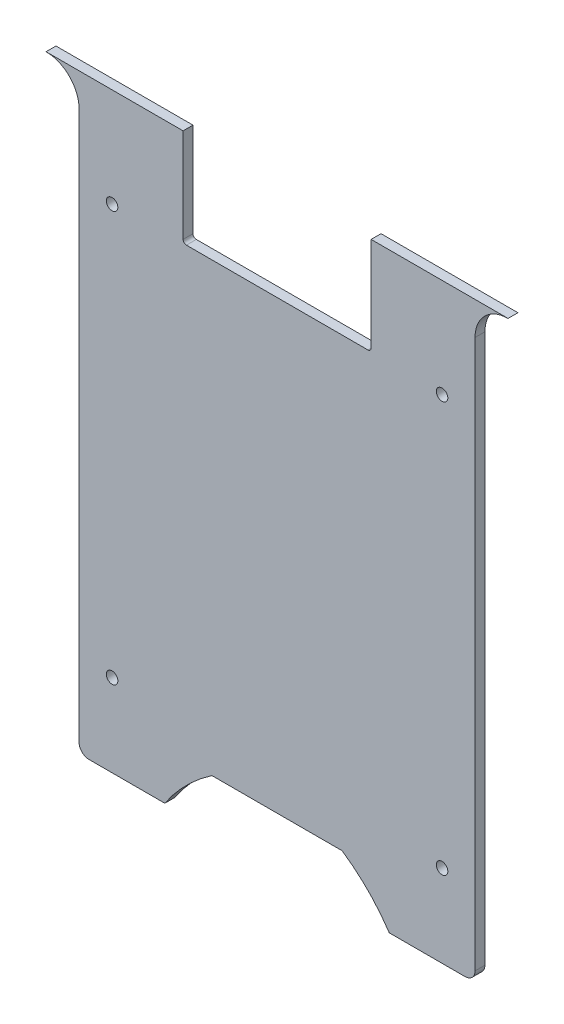
ISO-10303-21;
HEADER;
FILE_DESCRIPTION(('STEP AP214'),'2;1');
FILE_NAME('part.step','',(''),(''),'','','');
FILE_SCHEMA(('AUTOMOTIVE_DESIGN { 1 0 10303 214 1 1 1 1 }'));
ENDSEC;
DATA;
#1=APPLICATION_CONTEXT('core data for automotive mechanical design processes');
#2=APPLICATION_PROTOCOL_DEFINITION('international standard','automotive_design',2000,#1);
#3=PRODUCT_CONTEXT('',#1,'mechanical');
#4=PRODUCT('Part','Part','',(#3));
#5=PRODUCT_RELATED_PRODUCT_CATEGORY('part','',(#4));
#6=PRODUCT_DEFINITION_FORMATION('','',#4);
#7=PRODUCT_DEFINITION_CONTEXT('part definition',#1,'design');
#8=PRODUCT_DEFINITION('design','',#6,#7);
#9=PRODUCT_DEFINITION_SHAPE('','',#8);
#10=(LENGTH_UNIT() NAMED_UNIT(*) SI_UNIT(.MILLI.,.METRE.));
#11=(NAMED_UNIT(*) PLANE_ANGLE_UNIT() SI_UNIT($,.RADIAN.));
#12=(NAMED_UNIT(*) SI_UNIT($,.STERADIAN.) SOLID_ANGLE_UNIT());
#13=UNCERTAINTY_MEASURE_WITH_UNIT(LENGTH_MEASURE(1.E-05),#10,'distance_accuracy_value','');
#14=(GEOMETRIC_REPRESENTATION_CONTEXT(3) GLOBAL_UNCERTAINTY_ASSIGNED_CONTEXT((#13)) GLOBAL_UNIT_ASSIGNED_CONTEXT((#10,
#11,#12)) REPRESENTATION_CONTEXT('',''));
#15=CARTESIAN_POINT('',(0.,0.,0.));
#16=DIRECTION('',(0.,0.,1.));
#17=DIRECTION('',(1.,0.,0.));
#18=AXIS2_PLACEMENT_3D('',#15,#16,#17);
#19=CARTESIAN_POINT('',(70.0000000001152,209.000000001088,3.));
#20=DIRECTION('',(0.,0.,1.));
#21=DIRECTION('',(1.,0.,0.));
#22=AXIS2_PLACEMENT_3D('',#19,#20,#21);
#23=PLANE('',#22);
#24=CARTESIAN_POINT('',(-49.9999999991571,64.7462925295439,3.));
#25=DIRECTION('',(0.,0.,1.));
#26=DIRECTION('',(1.,0.,0.));
#27=AXIS2_PLACEMENT_3D('',#24,#25,#26);
#28=CIRCLE('',#27,1.75);
#29=CARTESIAN_POINT('',(-48.2499999991571,64.7462925295439,3.));
#30=VERTEX_POINT('',#29);
#31=EDGE_CURVE('E425',#30,#30,#28,.T.);
#32=ORIENTED_EDGE('',*,*,#31,.F.);
#33=EDGE_LOOP('',(#32));
#34=FACE_BOUND('',#33,.T.);
#35=CARTESIAN_POINT('',(-49.9999999998462,189.00000000042,3.));
#36=DIRECTION('',(0.,0.,1.));
#37=DIRECTION('',(1.,0.,0.));
#38=AXIS2_PLACEMENT_3D('',#35,#36,#37);
#39=CIRCLE('',#38,1.75);
#40=CARTESIAN_POINT('',(-48.2499999998462,189.00000000042,3.));
#41=VERTEX_POINT('',#40);
#42=EDGE_CURVE('E198',#41,#41,#39,.T.);
#43=ORIENTED_EDGE('',*,*,#42,.F.);
#44=EDGE_LOOP('',(#43));
#45=FACE_BOUND('',#44,.T.);
#46=DIRECTION('',(0.,-1.,0.));
#47=VECTOR('',#46,1.);
#48=CARTESIAN_POINT('',(28.5102372748207,190.499999943556,3.));
#49=LINE('',#48,#47);
#50=CARTESIAN_POINT('',(28.5102372748207,219.000000001088,3.));
#51=VERTEX_POINT('',#50);
#52=CARTESIAN_POINT('',(28.5102372748207,190.499999943556,3.));
#53=VERTEX_POINT('',#52);
#54=EDGE_CURVE('E239',#51,#53,#49,.T.);
#55=ORIENTED_EDGE('',*,*,#54,.T.);
#56=CARTESIAN_POINT('',(27.5102372748207,190.499999943556,3.));
#57=DIRECTION('',(0.,0.,-1.));
#58=DIRECTION('',(-1.,0.,0.));
#59=AXIS2_PLACEMENT_3D('',#56,#57,#58);
#60=CIRCLE('',#59,0.999999999999987);
#61=CARTESIAN_POINT('',(27.5102372748207,189.499999943556,3.));
#62=VERTEX_POINT('',#61);
#63=EDGE_CURVE('E127',#53,#62,#60,.T.);
#64=ORIENTED_EDGE('',*,*,#63,.T.);
#65=DIRECTION('',(-1.,0.,0.));
#66=VECTOR('',#65,1.);
#67=CARTESIAN_POINT('',(-27.4692881775994,189.49999994356,3.));
#68=LINE('',#67,#66);
#69=CARTESIAN_POINT('',(-27.4692881775994,189.49999994356,3.));
#70=VERTEX_POINT('',#69);
#71=EDGE_CURVE('E284',#62,#70,#68,.T.);
#72=ORIENTED_EDGE('',*,*,#71,.T.);
#73=CARTESIAN_POINT('',(-27.4692881775993,190.49999994356,3.));
#74=DIRECTION('',(0.,0.,-1.));
#75=DIRECTION('',(-1.,0.,0.));
#76=AXIS2_PLACEMENT_3D('',#73,#74,#75);
#77=CIRCLE('',#76,1.);
#78=CARTESIAN_POINT('',(-28.4692881775993,190.49999994356,3.));
#79=VERTEX_POINT('',#78);
#80=EDGE_CURVE('E303',#70,#79,#77,.T.);
#81=ORIENTED_EDGE('',*,*,#80,.T.);
#82=DIRECTION('',(0.,1.,0.));
#83=VECTOR('',#82,1.);
#84=CARTESIAN_POINT('',(-28.4692881775993,218.999999943458,3.));
#85=LINE('',#84,#83);
#86=CARTESIAN_POINT('',(-28.4692881775993,218.999999943458,3.));
#87=VERTEX_POINT('',#86);
#88=EDGE_CURVE('E300',#79,#87,#85,.T.);
#89=ORIENTED_EDGE('',*,*,#88,.T.);
#90=DIRECTION('',(-1.,0.,0.));
#91=VECTOR('',#90,1.);
#92=CARTESIAN_POINT('',(-69.9999999990349,218.999999943458,3.));
#93=LINE('',#92,#91);
#94=CARTESIAN_POINT('',(-69.9999999990349,218.999999943458,3.));
#95=VERTEX_POINT('',#94);
#96=EDGE_CURVE('E302',#87,#95,#93,.T.);
#97=ORIENTED_EDGE('',*,*,#96,.T.);
#98=CARTESIAN_POINT('',(-69.9999999989792,208.999999943458,3.));
#99=DIRECTION('',(0.,0.,-1.));
#100=DIRECTION('',(1.,0.,0.));
#101=AXIS2_PLACEMENT_3D('',#98,#99,#100);
#102=CIRCLE('',#101,9.99999999999998);
#103=CARTESIAN_POINT('',(-59.9999999989792,208.999999943516,3.));
#104=VERTEX_POINT('',#103);
#105=EDGE_CURVE('E305',#95,#104,#102,.T.);
#106=ORIENTED_EDGE('',*,*,#105,.T.);
#107=DIRECTION('',(0.,-1.,0.));
#108=VECTOR('',#107,1.);
#109=CARTESIAN_POINT('',(-59.9999999989792,208.999999943516,3.));
#110=LINE('',#109,#108);
#111=CARTESIAN_POINT('',(-59.9999999989792,42.7462924726252,3.));
#112=VERTEX_POINT('',#111);
#113=EDGE_CURVE('E311',#104,#112,#110,.T.);
#114=ORIENTED_EDGE('',*,*,#113,.T.);
#115=CARTESIAN_POINT('',(-56.9999999989792,42.7462924726418,3.));
#116=DIRECTION('',(0.,0.,1.));
#117=DIRECTION('',(1.,0.,0.));
#118=AXIS2_PLACEMENT_3D('',#115,#116,#117);
#119=CIRCLE('',#118,3.);
#120=CARTESIAN_POINT('',(-56.9999999989626,39.7462924726418,3.));
#121=VERTEX_POINT('',#120);
#122=EDGE_CURVE('E313',#112,#121,#119,.T.);
#123=ORIENTED_EDGE('',*,*,#122,.T.);
#124=DIRECTION('',(1.,4.26790166105366E-12,0.));
#125=VECTOR('',#124,1.);
#126=CARTESIAN_POINT('',(-56.9999999989626,39.7462924726418,3.));
#127=LINE('',#126,#125);
#128=CARTESIAN_POINT('',(-34.0107262452154,39.7462924157872,3.));
#129=VERTEX_POINT('',#128);
#130=EDGE_CURVE('E315',#121,#129,#127,.T.);
#131=ORIENTED_EDGE('',*,*,#130,.T.);
#132=CARTESIAN_POINT('',(726935.620095685,-686704.778338699,3.));
#133=CARTESIAN_POINT('',(-733933.246238022,679299.080831453,3.));
#134=CARTESIAN_POINT('',(740815.524396622,-671708.118039999,3.));
#135=B_SPLINE_CURVE_WITH_KNOTS('',2,(#132,#133,#134),.UNSPECIFIED.,.F.,.F.,(3,3),(0.,1.),.UNSPECIFIED.);
#136=CARTESIAN_POINT('',(-19.7265804173894,54.1500000005924,3.));
#137=VERTEX_POINT('',#136);
#138=EDGE_CURVE('E317',#129,#137,#135,.T.);
#139=ORIENTED_EDGE('',*,*,#138,.T.);
#140=DIRECTION('',(1.,1.25816989656835E-09,0.));
#141=VECTOR('',#140,1.);
#142=CARTESIAN_POINT('',(-19.7265804173894,54.1500000005924,3.));
#143=LINE('',#142,#141);
#144=CARTESIAN_POINT('',(19.726580417978,54.1500000016666,3.));
#145=VERTEX_POINT('',#144);
#146=EDGE_CURVE('E322',#137,#145,#143,.T.);
#147=ORIENTED_EDGE('',*,*,#146,.T.);
#148=CARTESIAN_POINT('',(-740815.524389158,-671708.118048228,3.));
#149=CARTESIAN_POINT('',(733933.246230486,679299.080839598,3.));
#150=CARTESIAN_POINT('',(-726935.620088069,-686704.778346759,3.));
#151=B_SPLINE_CURVE_WITH_KNOTS('',2,(#148,#149,#150),.UNSPECIFIED.,.F.,.F.,(3,3),(0.,1.),.UNSPECIFIED.);
#152=CARTESIAN_POINT('',(34.0107261715021,39.7462925300098,3.));
#153=VERTEX_POINT('',#152);
#154=EDGE_CURVE('E396',#145,#153,#151,.T.);
#155=ORIENTED_EDGE('',*,*,#154,.T.);
#156=DIRECTION('',(1.,5.54585749580325E-12,0.));
#157=VECTOR('',#156,1.);
#158=CARTESIAN_POINT('',(34.0107261715021,39.7462925300098,3.));
#159=LINE('',#158,#157);
#160=CARTESIAN_POINT('',(57.0000000009995,39.7462925301373,3.));
#161=VERTEX_POINT('',#160);
#162=EDGE_CURVE('E401',#153,#161,#159,.T.);
#163=ORIENTED_EDGE('',*,*,#162,.T.);
#164=CARTESIAN_POINT('',(57.0000000009829,42.7462925301373,3.));
#165=DIRECTION('',(0.,0.,1.));
#166=DIRECTION('',(1.,0.,0.));
#167=AXIS2_PLACEMENT_3D('',#164,#165,#166);
#168=CIRCLE('',#167,3.);
#169=CARTESIAN_POINT('',(60.0000000009829,42.746292530154,3.));
#170=VERTEX_POINT('',#169);
#171=EDGE_CURVE('E176',#161,#170,#168,.T.);
#172=ORIENTED_EDGE('',*,*,#171,.T.);
#173=DIRECTION('',(-5.21880832516427E-12,1.,0.));
#174=VECTOR('',#173,1.);
#175=CARTESIAN_POINT('',(60.0000000009829,42.746292530154,3.));
#176=LINE('',#175,#174);
#177=CARTESIAN_POINT('',(60.0000000001152,209.000000001036,3.));
#178=VERTEX_POINT('',#177);
#179=EDGE_CURVE('E170',#170,#178,#176,.T.);
#180=ORIENTED_EDGE('',*,*,#179,.T.);
#181=CARTESIAN_POINT('',(70.0000000001152,209.000000001088,3.));
#182=DIRECTION('',(0.,0.,-1.));
#183=DIRECTION('',(1.,0.,0.));
#184=AXIS2_PLACEMENT_3D('',#181,#182,#183);
#185=CIRCLE('',#184,10.);
#186=CARTESIAN_POINT('',(70.0000000000054,219.000000001088,3.));
#187=VERTEX_POINT('',#186);
#188=EDGE_CURVE('E174',#178,#187,#185,.T.);
#189=ORIENTED_EDGE('',*,*,#188,.T.);
#190=DIRECTION('',(-1.,0.,0.));
#191=VECTOR('',#190,1.);
#192=CARTESIAN_POINT('',(28.5102372748207,219.000000001088,3.));
#193=LINE('',#192,#191);
#194=EDGE_CURVE('E54',#187,#51,#193,.T.);
#195=ORIENTED_EDGE('',*,*,#194,.T.);
#196=EDGE_LOOP('',(#55,#64,#72,#81,#89,#97,#106,#114,#123,#131,#139,#147,#155,#163,#172,#180,
#189,#195));
#197=FACE_BOUND('',#196,.T.);
#198=CARTESIAN_POINT('',(50.0000000002313,189.000000000981,3.));
#199=DIRECTION('',(0.,0.,1.));
#200=DIRECTION('',(1.,0.,0.));
#201=AXIS2_PLACEMENT_3D('',#198,#199,#200);
#202=CIRCLE('',#201,1.75000000000002);
#203=CARTESIAN_POINT('',(51.7500000002313,189.000000000981,3.));
#204=VERTEX_POINT('',#203);
#205=EDGE_CURVE('E419',#204,#204,#202,.T.);
#206=ORIENTED_EDGE('',*,*,#205,.F.);
#207=EDGE_LOOP('',(#206));
#208=FACE_BOUND('',#207,.T.);
#209=CARTESIAN_POINT('',(50.0000000009167,64.7462925300985,3.));
#210=DIRECTION('',(0.,0.,1.));
#211=DIRECTION('',(1.,0.,0.));
#212=AXIS2_PLACEMENT_3D('',#209,#210,#211);
#213=CIRCLE('',#212,1.75000000001983);
#214=CARTESIAN_POINT('',(51.7500000009365,64.7462925300985,3.));
#215=VERTEX_POINT('',#214);
#216=EDGE_CURVE('E431',#215,#215,#213,.T.);
#217=ORIENTED_EDGE('',*,*,#216,.F.);
#218=EDGE_LOOP('',(#217));
#219=FACE_BOUND('',#218,.T.);
#220=ADVANCED_FACE('F37',(#34,#45,#197,#208,#219),#23,.T.);
#221=CARTESIAN_POINT('',(70.0000000001152,209.000000001088,0.));
#222=DIRECTION('',(0.,0.,1.));
#223=DIRECTION('',(1.,0.,0.));
#224=AXIS2_PLACEMENT_3D('',#221,#222,#223);
#225=PLANE('',#224);
#226=DIRECTION('',(0.,-1.,0.));
#227=VECTOR('',#226,1.);
#228=CARTESIAN_POINT('',(28.5102372748207,190.499999943556,0.));
#229=LINE('',#228,#227);
#230=CARTESIAN_POINT('',(28.5102372748207,219.000000001088,0.));
#231=VERTEX_POINT('',#230);
#232=CARTESIAN_POINT('',(28.5102372748207,190.499999943556,0.));
#233=VERTEX_POINT('',#232);
#234=EDGE_CURVE('E194',#231,#233,#229,.T.);
#235=ORIENTED_EDGE('',*,*,#234,.F.);
#236=DIRECTION('',(-1.,0.,0.));
#237=VECTOR('',#236,1.);
#238=CARTESIAN_POINT('',(28.5102372748207,219.000000001088,0.));
#239=LINE('',#238,#237);
#240=CARTESIAN_POINT('',(70.0000000000054,219.000000001088,0.));
#241=VERTEX_POINT('',#240);
#242=EDGE_CURVE('E119',#241,#231,#239,.T.);
#243=ORIENTED_EDGE('',*,*,#242,.F.);
#244=CARTESIAN_POINT('',(70.0000000001152,209.000000001088,0.));
#245=DIRECTION('',(0.,0.,-1.));
#246=DIRECTION('',(1.,0.,0.));
#247=AXIS2_PLACEMENT_3D('',#244,#245,#246);
#248=CIRCLE('',#247,10.);
#249=CARTESIAN_POINT('',(60.0000000001152,209.000000001036,0.));
#250=VERTEX_POINT('',#249);
#251=EDGE_CURVE('E113',#250,#241,#248,.T.);
#252=ORIENTED_EDGE('',*,*,#251,.F.);
#253=DIRECTION('',(-5.21880832516427E-12,1.,0.));
#254=VECTOR('',#253,1.);
#255=CARTESIAN_POINT('',(60.0000000009829,42.746292530154,0.));
#256=LINE('',#255,#254);
#257=CARTESIAN_POINT('',(60.0000000009829,42.746292530154,0.));
#258=VERTEX_POINT('',#257);
#259=EDGE_CURVE('E184',#258,#250,#256,.T.);
#260=ORIENTED_EDGE('',*,*,#259,.F.);
#261=CARTESIAN_POINT('',(57.0000000009829,42.7462925301373,0.));
#262=DIRECTION('',(0.,0.,1.));
#263=DIRECTION('',(1.,0.,0.));
#264=AXIS2_PLACEMENT_3D('',#261,#262,#263);
#265=CIRCLE('',#264,3.);
#266=CARTESIAN_POINT('',(57.0000000009995,39.7462925301373,0.));
#267=VERTEX_POINT('',#266);
#268=EDGE_CURVE('E234',#267,#258,#265,.T.);
#269=ORIENTED_EDGE('',*,*,#268,.F.);
#270=DIRECTION('',(1.,5.54585749580325E-12,0.));
#271=VECTOR('',#270,1.);
#272=CARTESIAN_POINT('',(34.0107261715021,39.7462925300098,0.));
#273=LINE('',#272,#271);
#274=CARTESIAN_POINT('',(34.0107261715021,39.7462925300098,0.));
#275=VERTEX_POINT('',#274);
#276=EDGE_CURVE('E229',#275,#267,#273,.T.);
#277=ORIENTED_EDGE('',*,*,#276,.F.);
#278=CARTESIAN_POINT('',(-740815.524389158,-671708.118048228,0.));
#279=CARTESIAN_POINT('',(733933.246230486,679299.080839598,0.));
#280=CARTESIAN_POINT('',(-726935.620088069,-686704.778346759,0.));
#281=B_SPLINE_CURVE_WITH_KNOTS('',2,(#278,#279,#280),.UNSPECIFIED.,.F.,.F.,(3,3),(0.,1.),.UNSPECIFIED.);
#282=CARTESIAN_POINT('',(19.726580417978,54.1500000016666,0.));
#283=VERTEX_POINT('',#282);
#284=EDGE_CURVE('E225',#283,#275,#281,.T.);
#285=ORIENTED_EDGE('',*,*,#284,.F.);
#286=DIRECTION('',(1.,1.25816989656835E-09,0.));
#287=VECTOR('',#286,1.);
#288=CARTESIAN_POINT('',(-19.7265804173894,54.1500000005924,0.));
#289=LINE('',#288,#287);
#290=CARTESIAN_POINT('',(-19.7265804173894,54.1500000005924,0.));
#291=VERTEX_POINT('',#290);
#292=EDGE_CURVE('E220',#291,#283,#289,.T.);
#293=ORIENTED_EDGE('',*,*,#292,.F.);
#294=CARTESIAN_POINT('',(726935.620095685,-686704.778338699,0.));
#295=CARTESIAN_POINT('',(-733933.246238022,679299.080831453,0.));
#296=CARTESIAN_POINT('',(740815.524396622,-671708.118039999,0.));
#297=B_SPLINE_CURVE_WITH_KNOTS('',2,(#294,#295,#296),.UNSPECIFIED.,.F.,.F.,(3,3),(0.,1.),.UNSPECIFIED.);
#298=CARTESIAN_POINT('',(-34.0107262452154,39.7462924157872,0.));
#299=VERTEX_POINT('',#298);
#300=EDGE_CURVE('E216',#299,#291,#297,.T.);
#301=ORIENTED_EDGE('',*,*,#300,.F.);
#302=DIRECTION('',(1.,4.26790166105366E-12,0.));
#303=VECTOR('',#302,1.);
#304=CARTESIAN_POINT('',(-56.9999999989626,39.7462924726418,0.));
#305=LINE('',#304,#303);
#306=CARTESIAN_POINT('',(-56.9999999989626,39.7462924726418,0.));
#307=VERTEX_POINT('',#306);
#308=EDGE_CURVE('E214',#307,#299,#305,.T.);
#309=ORIENTED_EDGE('',*,*,#308,.F.);
#310=CARTESIAN_POINT('',(-56.9999999989792,42.7462924726418,0.));
#311=DIRECTION('',(0.,0.,1.));
#312=DIRECTION('',(1.,0.,0.));
#313=AXIS2_PLACEMENT_3D('',#310,#311,#312);
#314=CIRCLE('',#313,3.);
#315=CARTESIAN_POINT('',(-59.9999999989792,42.7462924726252,0.));
#316=VERTEX_POINT('',#315);
#317=EDGE_CURVE('E212',#316,#307,#314,.T.);
#318=ORIENTED_EDGE('',*,*,#317,.F.);
#319=DIRECTION('',(0.,-1.,0.));
#320=VECTOR('',#319,1.);
#321=CARTESIAN_POINT('',(-59.9999999989792,208.999999943516,0.));
#322=LINE('',#321,#320);
#323=CARTESIAN_POINT('',(-59.9999999989792,208.999999943516,0.));
#324=VERTEX_POINT('',#323);
#325=EDGE_CURVE('E210',#324,#316,#322,.T.);
#326=ORIENTED_EDGE('',*,*,#325,.F.);
#327=CARTESIAN_POINT('',(-69.9999999989792,208.999999943458,0.));
#328=DIRECTION('',(0.,0.,-1.));
#329=DIRECTION('',(1.,0.,0.));
#330=AXIS2_PLACEMENT_3D('',#327,#328,#329);
#331=CIRCLE('',#330,9.99999999999998);
#332=CARTESIAN_POINT('',(-69.9999999990349,218.999999943458,0.));
#333=VERTEX_POINT('',#332);
#334=EDGE_CURVE('E208',#333,#324,#331,.T.);
#335=ORIENTED_EDGE('',*,*,#334,.F.);
#336=DIRECTION('',(-1.,0.,0.));
#337=VECTOR('',#336,1.);
#338=CARTESIAN_POINT('',(-69.9999999990349,218.999999943458,0.));
#339=LINE('',#338,#337);
#340=CARTESIAN_POINT('',(-28.4692881775993,218.999999943458,0.));
#341=VERTEX_POINT('',#340);
#342=EDGE_CURVE('E206',#341,#333,#339,.T.);
#343=ORIENTED_EDGE('',*,*,#342,.F.);
#344=DIRECTION('',(0.,1.,0.));
#345=VECTOR('',#344,1.);
#346=CARTESIAN_POINT('',(-28.4692881775993,218.999999943458,0.));
#347=LINE('',#346,#345);
#348=CARTESIAN_POINT('',(-28.4692881775993,190.49999994356,0.));
#349=VERTEX_POINT('',#348);
#350=EDGE_CURVE('E204',#349,#341,#347,.T.);
#351=ORIENTED_EDGE('',*,*,#350,.F.);
#352=CARTESIAN_POINT('',(-27.4692881775993,190.49999994356,0.));
#353=DIRECTION('',(0.,0.,-1.));
#354=DIRECTION('',(-1.,0.,0.));
#355=AXIS2_PLACEMENT_3D('',#352,#353,#354);
#356=CIRCLE('',#355,1.);
#357=CARTESIAN_POINT('',(-27.4692881775994,189.49999994356,0.));
#358=VERTEX_POINT('',#357);
#359=EDGE_CURVE('E202',#358,#349,#356,.T.);
#360=ORIENTED_EDGE('',*,*,#359,.F.);
#361=DIRECTION('',(-1.,0.,0.));
#362=VECTOR('',#361,1.);
#363=CARTESIAN_POINT('',(-27.4692881775994,189.49999994356,0.));
#364=LINE('',#363,#362);
#365=CARTESIAN_POINT('',(27.5102372748207,189.499999943556,0.));
#366=VERTEX_POINT('',#365);
#367=EDGE_CURVE('E200',#366,#358,#364,.T.);
#368=ORIENTED_EDGE('',*,*,#367,.F.);
#369=CARTESIAN_POINT('',(27.5102372748207,190.499999943556,0.));
#370=DIRECTION('',(0.,0.,-1.));
#371=DIRECTION('',(-1.,0.,0.));
#372=AXIS2_PLACEMENT_3D('',#369,#370,#371);
#373=CIRCLE('',#372,0.999999999999987);
#374=EDGE_CURVE('E197',#233,#366,#373,.T.);
#375=ORIENTED_EDGE('',*,*,#374,.F.);
#376=EDGE_LOOP('',(#235,#243,#252,#260,#269,#277,#285,#293,#301,#309,#318,#326,#335,#343,#351,
#360,#368,#375));
#377=FACE_BOUND('',#376,.T.);
#378=CARTESIAN_POINT('',(-49.9999999998462,189.00000000042,0.));
#379=DIRECTION('',(0.,0.,1.));
#380=DIRECTION('',(1.,0.,0.));
#381=AXIS2_PLACEMENT_3D('',#378,#379,#380);
#382=CIRCLE('',#381,1.75);
#383=CARTESIAN_POINT('',(-48.2499999998462,189.00000000042,0.));
#384=VERTEX_POINT('',#383);
#385=EDGE_CURVE('E416',#384,#384,#382,.T.);
#386=ORIENTED_EDGE('',*,*,#385,.T.);
#387=EDGE_LOOP('',(#386));
#388=FACE_BOUND('',#387,.T.);
#389=CARTESIAN_POINT('',(50.0000000002313,189.000000000981,0.));
#390=DIRECTION('',(0.,0.,1.));
#391=DIRECTION('',(1.,0.,0.));
#392=AXIS2_PLACEMENT_3D('',#389,#390,#391);
#393=CIRCLE('',#392,1.75000000000002);
#394=CARTESIAN_POINT('',(51.7500000002313,189.000000000981,0.));
#395=VERTEX_POINT('',#394);
#396=EDGE_CURVE('E422',#395,#395,#393,.T.);
#397=ORIENTED_EDGE('',*,*,#396,.T.);
#398=EDGE_LOOP('',(#397));
#399=FACE_BOUND('',#398,.T.);
#400=CARTESIAN_POINT('',(-49.9999999991571,64.7462925295439,0.));
#401=DIRECTION('',(0.,0.,1.));
#402=DIRECTION('',(1.,0.,0.));
#403=AXIS2_PLACEMENT_3D('',#400,#401,#402);
#404=CIRCLE('',#403,1.75);
#405=CARTESIAN_POINT('',(-48.2499999991571,64.7462925295439,0.));
#406=VERTEX_POINT('',#405);
#407=EDGE_CURVE('E428',#406,#406,#404,.T.);
#408=ORIENTED_EDGE('',*,*,#407,.T.);
#409=EDGE_LOOP('',(#408));
#410=FACE_BOUND('',#409,.T.);
#411=CARTESIAN_POINT('',(50.0000000009167,64.7462925300985,0.));
#412=DIRECTION('',(0.,0.,1.));
#413=DIRECTION('',(1.,0.,0.));
#414=AXIS2_PLACEMENT_3D('',#411,#412,#413);
#415=CIRCLE('',#414,1.75000000001983);
#416=CARTESIAN_POINT('',(51.7500000009365,64.7462925300985,0.));
#417=VERTEX_POINT('',#416);
#418=EDGE_CURVE('E434',#417,#417,#415,.T.);
#419=ORIENTED_EDGE('',*,*,#418,.T.);
#420=EDGE_LOOP('',(#419));
#421=FACE_BOUND('',#420,.T.);
#422=ADVANCED_FACE('F288',(#377,#388,#399,#410,#421),#225,.F.);
#423=CARTESIAN_POINT('',(28.5102372748207,190.499999943556,3.));
#424=DIRECTION('',(1.,0.,0.));
#425=DIRECTION('',(0.,0.,-1.));
#426=AXIS2_PLACEMENT_3D('',#423,#424,#425);
#427=PLANE('',#426);
#428=ORIENTED_EDGE('',*,*,#234,.T.);
#429=DIRECTION('',(0.,0.,-1.));
#430=VECTOR('',#429,1.);
#431=CARTESIAN_POINT('',(28.5102372748207,190.499999943556,3.));
#432=LINE('',#431,#430);
#433=EDGE_CURVE('E11',#53,#233,#432,.T.);
#434=ORIENTED_EDGE('',*,*,#433,.F.);
#435=ORIENTED_EDGE('',*,*,#54,.F.);
#436=DIRECTION('',(0.,0.,-1.));
#437=VECTOR('',#436,1.);
#438=CARTESIAN_POINT('',(28.5102372748207,219.000000001088,3.));
#439=LINE('',#438,#437);
#440=EDGE_CURVE('E190',#51,#231,#439,.T.);
#441=ORIENTED_EDGE('',*,*,#440,.T.);
#442=EDGE_LOOP('',(#428,#434,#435,#441));
#443=FACE_BOUND('',#442,.T.);
#444=ADVANCED_FACE('F39',(#443),#427,.F.);
#445=CARTESIAN_POINT('',(27.5102372748207,190.499999943556,3.));
#446=DIRECTION('',(0.,0.,-1.));
#447=DIRECTION('',(-1.,0.,0.));
#448=AXIS2_PLACEMENT_3D('',#445,#446,#447);
#449=CYLINDRICAL_SURFACE('',#448,0.999999999999987);
#450=ORIENTED_EDGE('',*,*,#374,.T.);
#451=DIRECTION('',(0.,0.,-1.));
#452=VECTOR('',#451,1.);
#453=CARTESIAN_POINT('',(27.5102372748207,189.499999943556,3.));
#454=LINE('',#453,#452);
#455=EDGE_CURVE('E46',#62,#366,#454,.T.);
#456=ORIENTED_EDGE('',*,*,#455,.F.);
#457=ORIENTED_EDGE('',*,*,#63,.F.);
#458=ORIENTED_EDGE('',*,*,#433,.T.);
#459=EDGE_LOOP('',(#450,#456,#457,#458));
#460=FACE_BOUND('',#459,.T.);
#461=ADVANCED_FACE('F360',(#460),#449,.F.);
#462=CARTESIAN_POINT('',(-27.4692881775994,189.49999994356,3.));
#463=DIRECTION('',(0.,-1.,0.));
#464=DIRECTION('',(1.,0.,0.));
#465=AXIS2_PLACEMENT_3D('',#462,#463,#464);
#466=PLANE('',#465);
#467=ORIENTED_EDGE('',*,*,#367,.T.);
#468=DIRECTION('',(0.,0.,-1.));
#469=VECTOR('',#468,1.);
#470=CARTESIAN_POINT('',(-27.4692881775994,189.49999994356,3.));
#471=LINE('',#470,#469);
#472=EDGE_CURVE('E276',#70,#358,#471,.T.);
#473=ORIENTED_EDGE('',*,*,#472,.F.);
#474=ORIENTED_EDGE('',*,*,#71,.F.);
#475=ORIENTED_EDGE('',*,*,#455,.T.);
#476=EDGE_LOOP('',(#467,#473,#474,#475));
#477=FACE_BOUND('',#476,.T.);
#478=ADVANCED_FACE('F282',(#477),#466,.F.);
#479=CARTESIAN_POINT('',(-27.4692881775993,190.49999994356,3.));
#480=DIRECTION('',(0.,0.,-1.));
#481=DIRECTION('',(-1.,0.,0.));
#482=AXIS2_PLACEMENT_3D('',#479,#480,#481);
#483=CYLINDRICAL_SURFACE('',#482,1.);
#484=ORIENTED_EDGE('',*,*,#359,.T.);
#485=DIRECTION('',(0.,0.,-1.));
#486=VECTOR('',#485,1.);
#487=CARTESIAN_POINT('',(-28.4692881775993,190.49999994356,3.));
#488=LINE('',#487,#486);
#489=EDGE_CURVE('E273',#79,#349,#488,.T.);
#490=ORIENTED_EDGE('',*,*,#489,.F.);
#491=ORIENTED_EDGE('',*,*,#80,.F.);
#492=ORIENTED_EDGE('',*,*,#472,.T.);
#493=EDGE_LOOP('',(#484,#490,#491,#492));
#494=FACE_BOUND('',#493,.T.);
#495=ADVANCED_FACE('F294',(#494),#483,.F.);
#496=CARTESIAN_POINT('',(-28.4692881775993,218.999999943458,3.));
#497=DIRECTION('',(-1.,0.,0.));
#498=DIRECTION('',(0.,0.,1.));
#499=AXIS2_PLACEMENT_3D('',#496,#497,#498);
#500=PLANE('',#499);
#501=ORIENTED_EDGE('',*,*,#350,.T.);
#502=DIRECTION('',(0.,0.,-1.));
#503=VECTOR('',#502,1.);
#504=CARTESIAN_POINT('',(-28.4692881775993,218.999999943458,3.));
#505=LINE('',#504,#503);
#506=EDGE_CURVE('E270',#87,#341,#505,.T.);
#507=ORIENTED_EDGE('',*,*,#506,.F.);
#508=ORIENTED_EDGE('',*,*,#88,.F.);
#509=ORIENTED_EDGE('',*,*,#489,.T.);
#510=EDGE_LOOP('',(#501,#507,#508,#509));
#511=FACE_BOUND('',#510,.T.);
#512=ADVANCED_FACE('F298',(#511),#500,.F.);
#513=CARTESIAN_POINT('',(-69.9999999990349,218.999999943458,3.));
#514=DIRECTION('',(0.,-1.,0.));
#515=DIRECTION('',(0.,0.,-1.));
#516=AXIS2_PLACEMENT_3D('',#513,#514,#515);
#517=PLANE('',#516);
#518=ORIENTED_EDGE('',*,*,#342,.T.);
#519=DIRECTION('',(0.,0.,-1.));
#520=VECTOR('',#519,1.);
#521=CARTESIAN_POINT('',(-69.9999999990349,218.999999943458,3.));
#522=LINE('',#521,#520);
#523=EDGE_CURVE('E267',#95,#333,#522,.T.);
#524=ORIENTED_EDGE('',*,*,#523,.F.);
#525=ORIENTED_EDGE('',*,*,#96,.F.);
#526=ORIENTED_EDGE('',*,*,#506,.T.);
#527=EDGE_LOOP('',(#518,#524,#525,#526));
#528=FACE_BOUND('',#527,.T.);
#529=ADVANCED_FACE('F350',(#528),#517,.F.);
#530=CARTESIAN_POINT('',(-69.9999999989792,208.999999943458,3.));
#531=DIRECTION('',(0.,0.,-1.));
#532=DIRECTION('',(-1.,0.,0.));
#533=AXIS2_PLACEMENT_3D('',#530,#531,#532);
#534=CYLINDRICAL_SURFACE('',#533,9.99999999999998);
#535=ORIENTED_EDGE('',*,*,#334,.T.);
#536=DIRECTION('',(0.,0.,-1.));
#537=VECTOR('',#536,1.);
#538=CARTESIAN_POINT('',(-59.9999999989792,208.999999943516,3.));
#539=LINE('',#538,#537);
#540=EDGE_CURVE('E264',#104,#324,#539,.T.);
#541=ORIENTED_EDGE('',*,*,#540,.F.);
#542=ORIENTED_EDGE('',*,*,#105,.F.);
#543=ORIENTED_EDGE('',*,*,#523,.T.);
#544=EDGE_LOOP('',(#535,#541,#542,#543));
#545=FACE_BOUND('',#544,.T.);
#546=ADVANCED_FACE('F346',(#545),#534,.F.);
#547=CARTESIAN_POINT('',(-59.9999999989792,208.999999943516,3.));
#548=DIRECTION('',(1.,0.,0.));
#549=DIRECTION('',(0.,0.,-1.));
#550=AXIS2_PLACEMENT_3D('',#547,#548,#549);
#551=PLANE('',#550);
#552=ORIENTED_EDGE('',*,*,#325,.T.);
#553=DIRECTION('',(0.,0.,-1.));
#554=VECTOR('',#553,1.);
#555=CARTESIAN_POINT('',(-59.9999999989792,42.7462924726252,3.));
#556=LINE('',#555,#554);
#557=EDGE_CURVE('E261',#112,#316,#556,.T.);
#558=ORIENTED_EDGE('',*,*,#557,.F.);
#559=ORIENTED_EDGE('',*,*,#113,.F.);
#560=ORIENTED_EDGE('',*,*,#540,.T.);
#561=EDGE_LOOP('',(#552,#558,#559,#560));
#562=FACE_BOUND('',#561,.T.);
#563=ADVANCED_FACE('F342',(#562),#551,.F.);
#564=CARTESIAN_POINT('',(-56.9999999989792,42.7462924726418,3.));
#565=DIRECTION('',(0.,0.,-1.));
#566=DIRECTION('',(-1.,0.,0.));
#567=AXIS2_PLACEMENT_3D('',#564,#565,#566);
#568=CYLINDRICAL_SURFACE('',#567,3.);
#569=ORIENTED_EDGE('',*,*,#317,.T.);
#570=DIRECTION('',(0.,0.,-1.));
#571=VECTOR('',#570,1.);
#572=CARTESIAN_POINT('',(-56.9999999989626,39.7462924726418,3.));
#573=LINE('',#572,#571);
#574=EDGE_CURVE('E258',#121,#307,#573,.T.);
#575=ORIENTED_EDGE('',*,*,#574,.F.);
#576=ORIENTED_EDGE('',*,*,#122,.F.);
#577=ORIENTED_EDGE('',*,*,#557,.T.);
#578=EDGE_LOOP('',(#569,#575,#576,#577));
#579=FACE_BOUND('',#578,.T.);
#580=ADVANCED_FACE('F338',(#579),#568,.T.);
#581=CARTESIAN_POINT('',(-56.9999999989626,39.7462924726418,3.));
#582=DIRECTION('',(-4.26790166105366E-12,1.,0.));
#583=DIRECTION('',(-1.,-4.26790166105366E-12,0.));
#584=AXIS2_PLACEMENT_3D('',#581,#582,#583);
#585=PLANE('',#584);
#586=ORIENTED_EDGE('',*,*,#308,.T.);
#587=DIRECTION('',(0.,0.,-1.));
#588=VECTOR('',#587,1.);
#589=CARTESIAN_POINT('',(-34.0107262452154,39.7462924157872,3.));
#590=LINE('',#589,#588);
#591=EDGE_CURVE('E255',#129,#299,#590,.T.);
#592=ORIENTED_EDGE('',*,*,#591,.F.);
#593=ORIENTED_EDGE('',*,*,#130,.F.);
#594=ORIENTED_EDGE('',*,*,#574,.T.);
#595=EDGE_LOOP('',(#586,#592,#593,#594));
#596=FACE_BOUND('',#595,.T.);
#597=ADVANCED_FACE('F333',(#596),#585,.F.);
#598=DIRECTION('',(0.,0.,-1.));
#599=VECTOR('',#598,1.);
#600=SURFACE_OF_LINEAR_EXTRUSION('',#135,#599);
#601=ORIENTED_EDGE('',*,*,#300,.T.);
#602=DIRECTION('',(0.,0.,-1.));
#603=VECTOR('',#602,1.);
#604=CARTESIAN_POINT('',(-19.7265804173894,54.1500000005924,3.));
#605=LINE('',#604,#603);
#606=EDGE_CURVE('E252',#137,#291,#605,.T.);
#607=ORIENTED_EDGE('',*,*,#606,.F.);
#608=ORIENTED_EDGE('',*,*,#138,.F.);
#609=ORIENTED_EDGE('',*,*,#591,.T.);
#610=EDGE_LOOP('',(#601,#607,#608,#609));
#611=FACE_BOUND('',#610,.T.);
#612=ADVANCED_FACE('F328',(#611),#600,.F.);
#613=CARTESIAN_POINT('',(-19.7265804173894,54.1500000005924,3.));
#614=DIRECTION('',(-1.25816989656835E-09,1.,0.));
#615=DIRECTION('',(-1.,-1.25816989656835E-09,0.));
#616=AXIS2_PLACEMENT_3D('',#613,#614,#615);
#617=PLANE('',#616);
#618=ORIENTED_EDGE('',*,*,#292,.T.);
#619=DIRECTION('',(0.,0.,-1.));
#620=VECTOR('',#619,1.);
#621=CARTESIAN_POINT('',(19.726580417978,54.1500000016666,3.));
#622=LINE('',#621,#620);
#623=EDGE_CURVE('E249',#145,#283,#622,.T.);
#624=ORIENTED_EDGE('',*,*,#623,.F.);
#625=ORIENTED_EDGE('',*,*,#146,.F.);
#626=ORIENTED_EDGE('',*,*,#606,.T.);
#627=EDGE_LOOP('',(#618,#624,#625,#626));
#628=FACE_BOUND('',#627,.T.);
#629=ADVANCED_FACE('F332',(#628),#617,.F.);
#630=DIRECTION('',(0.,0.,-1.));
#631=VECTOR('',#630,1.);
#632=SURFACE_OF_LINEAR_EXTRUSION('',#151,#631);
#633=ORIENTED_EDGE('',*,*,#284,.T.);
#634=DIRECTION('',(0.,0.,-1.));
#635=VECTOR('',#634,1.);
#636=CARTESIAN_POINT('',(34.0107261715021,39.7462925300098,3.));
#637=LINE('',#636,#635);
#638=EDGE_CURVE('E246',#153,#275,#637,.T.);
#639=ORIENTED_EDGE('',*,*,#638,.F.);
#640=ORIENTED_EDGE('',*,*,#154,.F.);
#641=ORIENTED_EDGE('',*,*,#623,.T.);
#642=EDGE_LOOP('',(#633,#639,#640,#641));
#643=FACE_BOUND('',#642,.T.);
#644=ADVANCED_FACE('F392',(#643),#632,.F.);
#645=CARTESIAN_POINT('',(34.0107261715021,39.7462925300098,3.));
#646=DIRECTION('',(-5.54585749580325E-12,1.,0.));
#647=DIRECTION('',(-1.,-5.54585749580325E-12,0.));
#648=AXIS2_PLACEMENT_3D('',#645,#646,#647);
#649=PLANE('',#648);
#650=ORIENTED_EDGE('',*,*,#276,.T.);
#651=DIRECTION('',(0.,0.,-1.));
#652=VECTOR('',#651,1.);
#653=CARTESIAN_POINT('',(57.0000000009995,39.7462925301373,3.));
#654=LINE('',#653,#652);
#655=EDGE_CURVE('E243',#161,#267,#654,.T.);
#656=ORIENTED_EDGE('',*,*,#655,.F.);
#657=ORIENTED_EDGE('',*,*,#162,.F.);
#658=ORIENTED_EDGE('',*,*,#638,.T.);
#659=EDGE_LOOP('',(#650,#656,#657,#658));
#660=FACE_BOUND('',#659,.T.);
#661=ADVANCED_FACE('F389',(#660),#649,.F.);
#662=CARTESIAN_POINT('',(57.0000000009829,42.7462925301373,3.));
#663=DIRECTION('',(0.,0.,-1.));
#664=DIRECTION('',(-1.,0.,0.));
#665=AXIS2_PLACEMENT_3D('',#662,#663,#664);
#666=CYLINDRICAL_SURFACE('',#665,3.);
#667=ORIENTED_EDGE('',*,*,#268,.T.);
#668=DIRECTION('',(0.,0.,-1.));
#669=VECTOR('',#668,1.);
#670=CARTESIAN_POINT('',(60.0000000009829,42.746292530154,3.));
#671=LINE('',#670,#669);
#672=EDGE_CURVE('E185',#170,#258,#671,.T.);
#673=ORIENTED_EDGE('',*,*,#672,.F.);
#674=ORIENTED_EDGE('',*,*,#171,.F.);
#675=ORIENTED_EDGE('',*,*,#655,.T.);
#676=EDGE_LOOP('',(#667,#673,#674,#675));
#677=FACE_BOUND('',#676,.T.);
#678=ADVANCED_FACE('F386',(#677),#666,.T.);
#679=CARTESIAN_POINT('',(60.0000000009829,42.746292530154,3.));
#680=DIRECTION('',(-1.,-5.21880832516427E-12,0.));
#681=DIRECTION('',(5.21880832516427E-12,-1.,0.));
#682=AXIS2_PLACEMENT_3D('',#679,#680,#681);
#683=PLANE('',#682);
#684=ORIENTED_EDGE('',*,*,#259,.T.);
#685=DIRECTION('',(0.,0.,-1.));
#686=VECTOR('',#685,1.);
#687=CARTESIAN_POINT('',(60.0000000001152,209.000000001036,3.));
#688=LINE('',#687,#686);
#689=EDGE_CURVE('E181',#178,#250,#688,.T.);
#690=ORIENTED_EDGE('',*,*,#689,.F.);
#691=ORIENTED_EDGE('',*,*,#179,.F.);
#692=ORIENTED_EDGE('',*,*,#672,.T.);
#693=EDGE_LOOP('',(#684,#690,#691,#692));
#694=FACE_BOUND('',#693,.T.);
#695=ADVANCED_FACE('F182',(#694),#683,.F.);
#696=CARTESIAN_POINT('',(70.0000000001152,209.000000001088,3.));
#697=DIRECTION('',(0.,0.,-1.));
#698=DIRECTION('',(-1.,0.,0.));
#699=AXIS2_PLACEMENT_3D('',#696,#697,#698);
#700=CYLINDRICAL_SURFACE('',#699,10.);
#701=ORIENTED_EDGE('',*,*,#251,.T.);
#702=DIRECTION('',(0.,0.,-1.));
#703=VECTOR('',#702,1.);
#704=CARTESIAN_POINT('',(70.0000000000054,219.000000001088,3.));
#705=LINE('',#704,#703);
#706=EDGE_CURVE('E186',#187,#241,#705,.T.);
#707=ORIENTED_EDGE('',*,*,#706,.F.);
#708=ORIENTED_EDGE('',*,*,#188,.F.);
#709=ORIENTED_EDGE('',*,*,#689,.T.);
#710=EDGE_LOOP('',(#701,#707,#708,#709));
#711=FACE_BOUND('',#710,.T.);
#712=ADVANCED_FACE('F188',(#711),#700,.F.);
#713=CARTESIAN_POINT('',(28.5102372748207,219.000000001088,3.));
#714=DIRECTION('',(0.,-1.,0.));
#715=DIRECTION('',(0.,0.,-1.));
#716=AXIS2_PLACEMENT_3D('',#713,#714,#715);
#717=PLANE('',#716);
#718=ORIENTED_EDGE('',*,*,#242,.T.);
#719=ORIENTED_EDGE('',*,*,#440,.F.);
#720=ORIENTED_EDGE('',*,*,#194,.F.);
#721=ORIENTED_EDGE('',*,*,#706,.T.);
#722=EDGE_LOOP('',(#718,#719,#720,#721));
#723=FACE_BOUND('',#722,.T.);
#724=ADVANCED_FACE('F379',(#723),#717,.F.);
#725=CARTESIAN_POINT('',(-49.9999999998462,189.00000000042,3.));
#726=DIRECTION('',(0.,0.,-1.));
#727=DIRECTION('',(-1.,0.,0.));
#728=AXIS2_PLACEMENT_3D('',#725,#726,#727);
#729=CYLINDRICAL_SURFACE('',#728,1.75);
#730=ORIENTED_EDGE('',*,*,#42,.T.);
#731=EDGE_LOOP('',(#730));
#732=FACE_BOUND('',#731,.T.);
#733=ORIENTED_EDGE('',*,*,#385,.F.);
#734=EDGE_LOOP('',(#733));
#735=FACE_BOUND('',#734,.T.);
#736=ADVANCED_FACE('F376',(#732,#735),#729,.F.);
#737=CARTESIAN_POINT('',(50.0000000002313,189.000000000981,3.));
#738=DIRECTION('',(0.,0.,-1.));
#739=DIRECTION('',(-1.,0.,0.));
#740=AXIS2_PLACEMENT_3D('',#737,#738,#739);
#741=CYLINDRICAL_SURFACE('',#740,1.75000000000002);
#742=ORIENTED_EDGE('',*,*,#205,.T.);
#743=EDGE_LOOP('',(#742));
#744=FACE_BOUND('',#743,.T.);
#745=ORIENTED_EDGE('',*,*,#396,.F.);
#746=EDGE_LOOP('',(#745));
#747=FACE_BOUND('',#746,.T.);
#748=ADVANCED_FACE('F451',(#744,#747),#741,.F.);
#749=CARTESIAN_POINT('',(-49.9999999991571,64.7462925295439,3.));
#750=DIRECTION('',(0.,0.,-1.));
#751=DIRECTION('',(-1.,0.,0.));
#752=AXIS2_PLACEMENT_3D('',#749,#750,#751);
#753=CYLINDRICAL_SURFACE('',#752,1.75);
#754=ORIENTED_EDGE('',*,*,#31,.T.);
#755=EDGE_LOOP('',(#754));
#756=FACE_BOUND('',#755,.T.);
#757=ORIENTED_EDGE('',*,*,#407,.F.);
#758=EDGE_LOOP('',(#757));
#759=FACE_BOUND('',#758,.T.);
#760=ADVANCED_FACE('F444',(#756,#759),#753,.F.);
#761=CARTESIAN_POINT('',(50.0000000009167,64.7462925300985,3.));
#762=DIRECTION('',(0.,0.,-1.));
#763=DIRECTION('',(-1.,0.,0.));
#764=AXIS2_PLACEMENT_3D('',#761,#762,#763);
#765=CYLINDRICAL_SURFACE('',#764,1.75000000001983);
#766=ORIENTED_EDGE('',*,*,#216,.T.);
#767=EDGE_LOOP('',(#766));
#768=FACE_BOUND('',#767,.T.);
#769=ORIENTED_EDGE('',*,*,#418,.F.);
#770=EDGE_LOOP('',(#769));
#771=FACE_BOUND('',#770,.T.);
#772=ADVANCED_FACE('F440',(#768,#771),#765,.F.);
#773=CLOSED_SHELL('',(#220,#422,#444,#461,#478,#495,#512,#529,#546,#563,#580,#597,#612,#629,
#644,#661,#678,#695,#712,#724,#736,#748,#760,#772));
#774=MANIFOLD_SOLID_BREP('B2',#773);
#775=ADVANCED_BREP_SHAPE_REPRESENTATION('',(#18,#774),#14);
#776=SHAPE_DEFINITION_REPRESENTATION(#9,#775);
ENDSEC;
END-ISO-10303-21;
